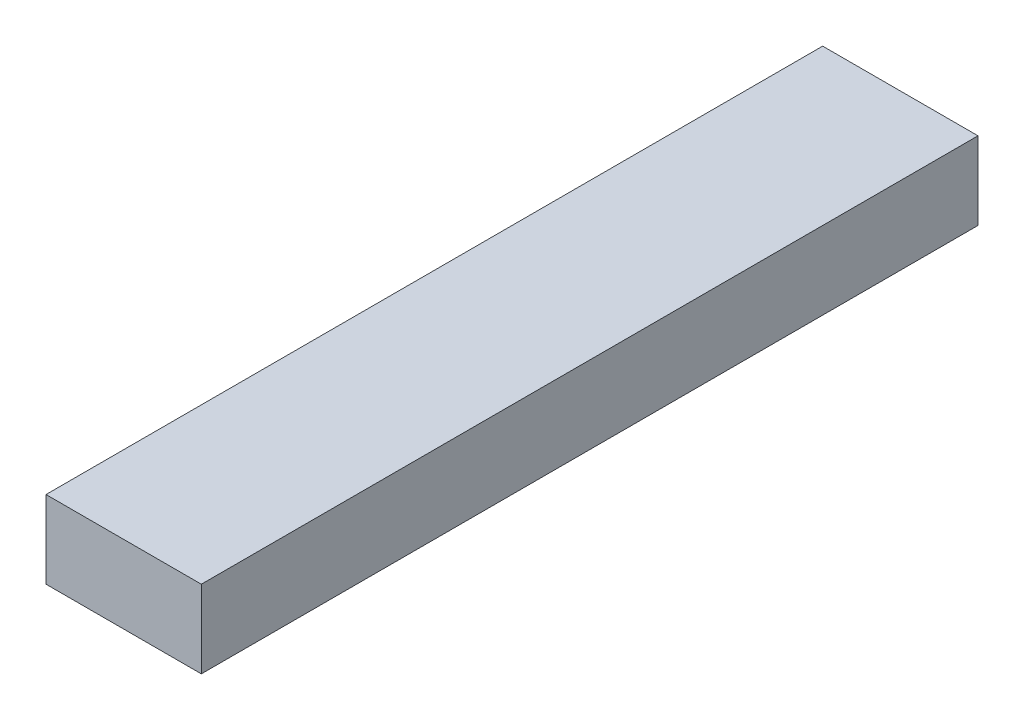
ISO-10303-21;
HEADER;
FILE_DESCRIPTION(('STEP AP214'),'2;1');
FILE_NAME('part.step','',(''),(''),'','','');
FILE_SCHEMA(('AUTOMOTIVE_DESIGN { 1 0 10303 214 1 1 1 1 }'));
ENDSEC;
DATA;
#1=APPLICATION_CONTEXT('core data for automotive mechanical design processes');
#2=APPLICATION_PROTOCOL_DEFINITION('international standard','automotive_design',2000,#1);
#3=PRODUCT_CONTEXT('',#1,'mechanical');
#4=PRODUCT('Part','Part','',(#3));
#5=PRODUCT_RELATED_PRODUCT_CATEGORY('part','',(#4));
#6=PRODUCT_DEFINITION_FORMATION('','',#4);
#7=PRODUCT_DEFINITION_CONTEXT('part definition',#1,'design');
#8=PRODUCT_DEFINITION('design','',#6,#7);
#9=PRODUCT_DEFINITION_SHAPE('','',#8);
#10=(LENGTH_UNIT() NAMED_UNIT(*) SI_UNIT(.MILLI.,.METRE.));
#11=(NAMED_UNIT(*) PLANE_ANGLE_UNIT() SI_UNIT($,.RADIAN.));
#12=(NAMED_UNIT(*) SI_UNIT($,.STERADIAN.) SOLID_ANGLE_UNIT());
#13=UNCERTAINTY_MEASURE_WITH_UNIT(LENGTH_MEASURE(1.E-05),#10,'distance_accuracy_value','');
#14=(GEOMETRIC_REPRESENTATION_CONTEXT(3) GLOBAL_UNCERTAINTY_ASSIGNED_CONTEXT((#13)) GLOBAL_UNIT_ASSIGNED_CONTEXT((#10,
#11,#12)) REPRESENTATION_CONTEXT('',''));
#15=CARTESIAN_POINT('',(0.,0.,0.));
#16=DIRECTION('',(0.,0.,1.));
#17=DIRECTION('',(1.,0.,0.));
#18=AXIS2_PLACEMENT_3D('',#15,#16,#17);
#19=CARTESIAN_POINT('',(-100.,-50.,1000.));
#20=DIRECTION('',(1.,0.,0.));
#21=DIRECTION('',(0.,0.,-1.));
#22=AXIS2_PLACEMENT_3D('',#19,#20,#21);
#23=PLANE('',#22);
#24=DIRECTION('',(0.,-1.,0.));
#25=VECTOR('',#24,1.);
#26=CARTESIAN_POINT('',(-100.,-50.,0.));
#27=LINE('',#26,#25);
#28=CARTESIAN_POINT('',(-100.,50.,0.));
#29=VERTEX_POINT('',#28);
#30=CARTESIAN_POINT('',(-100.,-50.,0.));
#31=VERTEX_POINT('',#30);
#32=EDGE_CURVE('E100',#29,#31,#27,.T.);
#33=ORIENTED_EDGE('',*,*,#32,.T.);
#34=DIRECTION('',(0.,0.,-1.));
#35=VECTOR('',#34,1.);
#36=CARTESIAN_POINT('',(-100.,-50.,1000.));
#37=LINE('',#36,#35);
#38=CARTESIAN_POINT('',(-100.,-50.,1000.));
#39=VERTEX_POINT('',#38);
#40=EDGE_CURVE('E11',#39,#31,#37,.T.);
#41=ORIENTED_EDGE('',*,*,#40,.F.);
#42=DIRECTION('',(0.,-1.,0.));
#43=VECTOR('',#42,1.);
#44=CARTESIAN_POINT('',(-100.,-50.,1000.));
#45=LINE('',#44,#43);
#46=CARTESIAN_POINT('',(-100.,50.,1000.));
#47=VERTEX_POINT('',#46);
#48=EDGE_CURVE('E88',#47,#39,#45,.T.);
#49=ORIENTED_EDGE('',*,*,#48,.F.);
#50=DIRECTION('',(0.,0.,-1.));
#51=VECTOR('',#50,1.);
#52=CARTESIAN_POINT('',(-100.,50.,1000.));
#53=LINE('',#52,#51);
#54=EDGE_CURVE('E96',#47,#29,#53,.T.);
#55=ORIENTED_EDGE('',*,*,#54,.T.);
#56=EDGE_LOOP('',(#33,#41,#49,#55));
#57=FACE_BOUND('',#56,.T.);
#58=ADVANCED_FACE('F37',(#57),#23,.F.);
#59=CARTESIAN_POINT('',(100.,-50.,1000.));
#60=DIRECTION('',(0.,1.,0.));
#61=DIRECTION('',(-1.,0.,0.));
#62=AXIS2_PLACEMENT_3D('',#59,#60,#61);
#63=PLANE('',#62);
#64=DIRECTION('',(1.,0.,0.));
#65=VECTOR('',#64,1.);
#66=CARTESIAN_POINT('',(100.,-50.,0.));
#67=LINE('',#66,#65);
#68=CARTESIAN_POINT('',(100.,-50.,0.));
#69=VERTEX_POINT('',#68);
#70=EDGE_CURVE('E92',#31,#69,#67,.T.);
#71=ORIENTED_EDGE('',*,*,#70,.T.);
#72=DIRECTION('',(0.,0.,-1.));
#73=VECTOR('',#72,1.);
#74=CARTESIAN_POINT('',(100.,-50.,1000.));
#75=LINE('',#74,#73);
#76=CARTESIAN_POINT('',(100.,-50.,1000.));
#77=VERTEX_POINT('',#76);
#78=EDGE_CURVE('E45',#77,#69,#75,.T.);
#79=ORIENTED_EDGE('',*,*,#78,.F.);
#80=DIRECTION('',(1.,0.,0.));
#81=VECTOR('',#80,1.);
#82=CARTESIAN_POINT('',(100.,-50.,1000.));
#83=LINE('',#82,#81);
#84=EDGE_CURVE('E83',#39,#77,#83,.T.);
#85=ORIENTED_EDGE('',*,*,#84,.F.);
#86=ORIENTED_EDGE('',*,*,#40,.T.);
#87=EDGE_LOOP('',(#71,#79,#85,#86));
#88=FACE_BOUND('',#87,.T.);
#89=ADVANCED_FACE('F91',(#88),#63,.F.);
#90=CARTESIAN_POINT('',(100.,-50.,1000.));
#91=DIRECTION('',(-1.,0.,0.));
#92=DIRECTION('',(0.,0.,1.));
#93=AXIS2_PLACEMENT_3D('',#90,#91,#92);
#94=PLANE('',#93);
#95=DIRECTION('',(0.,1.,0.));
#96=VECTOR('',#95,1.);
#97=CARTESIAN_POINT('',(100.,-50.,0.));
#98=LINE('',#97,#96);
#99=CARTESIAN_POINT('',(100.,50.,0.));
#100=VERTEX_POINT('',#99);
#101=EDGE_CURVE('E70',#69,#100,#98,.T.);
#102=ORIENTED_EDGE('',*,*,#101,.T.);
#103=DIRECTION('',(0.,0.,-1.));
#104=VECTOR('',#103,1.);
#105=CARTESIAN_POINT('',(100.,50.,1000.));
#106=LINE('',#105,#104);
#107=CARTESIAN_POINT('',(100.,50.,1000.));
#108=VERTEX_POINT('',#107);
#109=EDGE_CURVE('E93',#108,#100,#106,.T.);
#110=ORIENTED_EDGE('',*,*,#109,.F.);
#111=DIRECTION('',(0.,1.,0.));
#112=VECTOR('',#111,1.);
#113=CARTESIAN_POINT('',(100.,-50.,1000.));
#114=LINE('',#113,#112);
#115=EDGE_CURVE('E86',#77,#108,#114,.T.);
#116=ORIENTED_EDGE('',*,*,#115,.F.);
#117=ORIENTED_EDGE('',*,*,#78,.T.);
#118=EDGE_LOOP('',(#102,#110,#116,#117));
#119=FACE_BOUND('',#118,.T.);
#120=ADVANCED_FACE('F94',(#119),#94,.F.);
#121=CARTESIAN_POINT('',(100.,50.,1000.));
#122=DIRECTION('',(0.,-1.,0.));
#123=DIRECTION('',(1.,0.,0.));
#124=AXIS2_PLACEMENT_3D('',#121,#122,#123);
#125=PLANE('',#124);
#126=DIRECTION('',(-1.,0.,0.));
#127=VECTOR('',#126,1.);
#128=CARTESIAN_POINT('',(100.,50.,0.));
#129=LINE('',#128,#127);
#130=EDGE_CURVE('E76',#100,#29,#129,.T.);
#131=ORIENTED_EDGE('',*,*,#130,.T.);
#132=ORIENTED_EDGE('',*,*,#54,.F.);
#133=DIRECTION('',(-1.,0.,0.));
#134=VECTOR('',#133,1.);
#135=CARTESIAN_POINT('',(100.,50.,1000.));
#136=LINE('',#135,#134);
#137=EDGE_CURVE('E53',#108,#47,#136,.T.);
#138=ORIENTED_EDGE('',*,*,#137,.F.);
#139=ORIENTED_EDGE('',*,*,#109,.T.);
#140=EDGE_LOOP('',(#131,#132,#138,#139));
#141=FACE_BOUND('',#140,.T.);
#142=ADVANCED_FACE('F107',(#141),#125,.F.);
#143=CARTESIAN_POINT('',(0.,0.,1000.));
#144=DIRECTION('',(0.,0.,1.));
#145=DIRECTION('',(1.,0.,0.));
#146=AXIS2_PLACEMENT_3D('',#143,#144,#145);
#147=PLANE('',#146);
#148=ORIENTED_EDGE('',*,*,#48,.T.);
#149=ORIENTED_EDGE('',*,*,#84,.T.);
#150=ORIENTED_EDGE('',*,*,#115,.T.);
#151=ORIENTED_EDGE('',*,*,#137,.T.);
#152=EDGE_LOOP('',(#148,#149,#150,#151));
#153=FACE_BOUND('',#152,.T.);
#154=ADVANCED_FACE('F84',(#153),#147,.T.);
#155=CARTESIAN_POINT('',(0.,0.,0.));
#156=DIRECTION('',(0.,0.,1.));
#157=DIRECTION('',(1.,0.,0.));
#158=AXIS2_PLACEMENT_3D('',#155,#156,#157);
#159=PLANE('',#158);
#160=ORIENTED_EDGE('',*,*,#32,.F.);
#161=ORIENTED_EDGE('',*,*,#130,.F.);
#162=ORIENTED_EDGE('',*,*,#101,.F.);
#163=ORIENTED_EDGE('',*,*,#70,.F.);
#164=EDGE_LOOP('',(#160,#161,#162,#163));
#165=FACE_BOUND('',#164,.T.);
#166=ADVANCED_FACE('F110',(#165),#159,.F.);
#167=CLOSED_SHELL('',(#58,#89,#120,#142,#154,#166));
#168=MANIFOLD_SOLID_BREP('B2',#167);
#169=ADVANCED_BREP_SHAPE_REPRESENTATION('',(#18,#168),#14);
#170=SHAPE_DEFINITION_REPRESENTATION(#9,#169);
ENDSEC;
END-ISO-10303-21;
